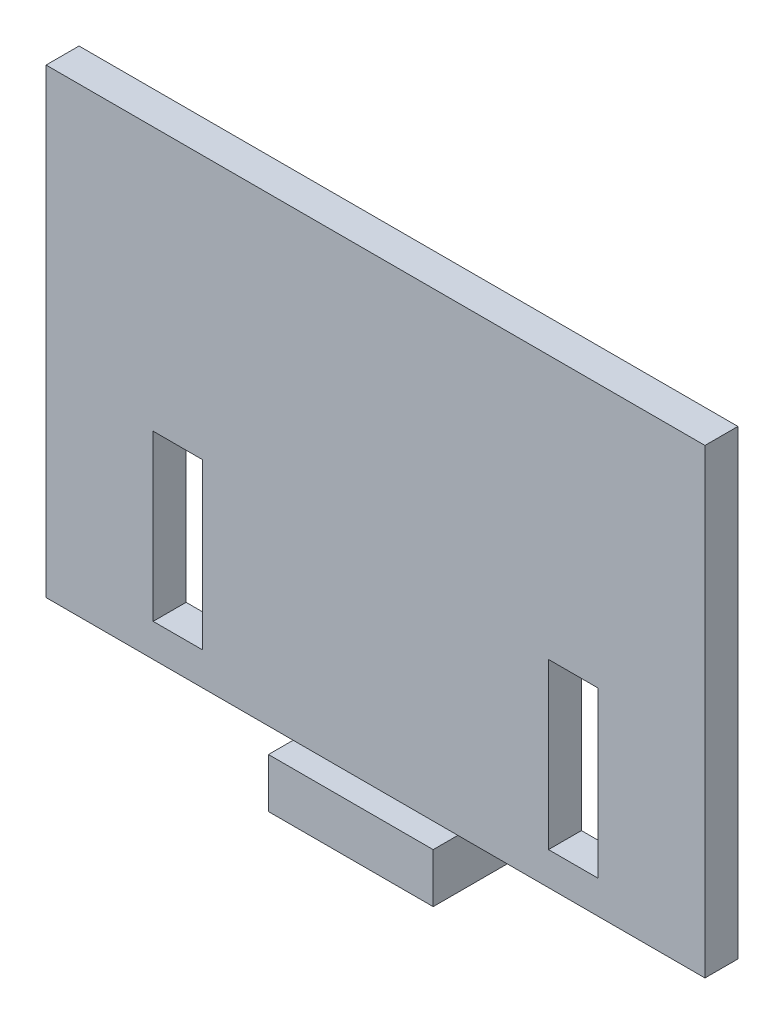
ISO-10303-21;
HEADER;
FILE_DESCRIPTION(('STEP AP214'),'2;1');
FILE_NAME('part.step','',(''),(''),'','','');
FILE_SCHEMA(('AUTOMOTIVE_DESIGN { 1 0 10303 214 1 1 1 1 }'));
ENDSEC;
DATA;
#1=APPLICATION_CONTEXT('core data for automotive mechanical design processes');
#2=APPLICATION_PROTOCOL_DEFINITION('international standard','automotive_design',2000,#1);
#3=PRODUCT_CONTEXT('',#1,'mechanical');
#4=PRODUCT('Part','Part','',(#3));
#5=PRODUCT_RELATED_PRODUCT_CATEGORY('part','',(#4));
#6=PRODUCT_DEFINITION_FORMATION('','',#4);
#7=PRODUCT_DEFINITION_CONTEXT('part definition',#1,'design');
#8=PRODUCT_DEFINITION('design','',#6,#7);
#9=PRODUCT_DEFINITION_SHAPE('','',#8);
#10=(LENGTH_UNIT() NAMED_UNIT(*) SI_UNIT(.MILLI.,.METRE.));
#11=(NAMED_UNIT(*) PLANE_ANGLE_UNIT() SI_UNIT($,.RADIAN.));
#12=(NAMED_UNIT(*) SI_UNIT($,.STERADIAN.) SOLID_ANGLE_UNIT());
#13=UNCERTAINTY_MEASURE_WITH_UNIT(LENGTH_MEASURE(1.E-05),#10,'distance_accuracy_value','');
#14=(GEOMETRIC_REPRESENTATION_CONTEXT(3) GLOBAL_UNCERTAINTY_ASSIGNED_CONTEXT((#13)) GLOBAL_UNIT_ASSIGNED_CONTEXT((#10,
#11,#12)) REPRESENTATION_CONTEXT('',''));
#15=CARTESIAN_POINT('',(0.,0.,0.));
#16=DIRECTION('',(0.,0.,1.));
#17=DIRECTION('',(1.,0.,0.));
#18=AXIS2_PLACEMENT_3D('',#15,#16,#17);
#19=CARTESIAN_POINT('',(-20.,-14.,2.));
#20=DIRECTION('',(0.,1.,0.));
#21=DIRECTION('',(0.,0.,1.));
#22=AXIS2_PLACEMENT_3D('',#19,#20,#21);
#23=PLANE('',#22);
#24=DIRECTION('',(0.,0.,1.));
#25=VECTOR('',#24,1.);
#26=CARTESIAN_POINT('',(5.,-14.,3.5));
#27=LINE('',#26,#25);
#28=CARTESIAN_POINT('',(5.,-14.,0.));
#29=VERTEX_POINT('',#28);
#30=CARTESIAN_POINT('',(5.,-14.,2.));
#31=VERTEX_POINT('',#30);
#32=EDGE_CURVE('E11',#29,#31,#27,.T.);
#33=ORIENTED_EDGE('',*,*,#32,.F.);
#34=DIRECTION('',(1.,0.,0.));
#35=VECTOR('',#34,1.);
#36=CARTESIAN_POINT('',(-20.,-14.,0.));
#37=LINE('',#36,#35);
#38=CARTESIAN_POINT('',(20.,-14.,0.));
#39=VERTEX_POINT('',#38);
#40=EDGE_CURVE('E278',#29,#39,#37,.T.);
#41=ORIENTED_EDGE('',*,*,#40,.T.);
#42=DIRECTION('',(0.,0.,-1.));
#43=VECTOR('',#42,1.);
#44=CARTESIAN_POINT('',(20.,-14.,2.));
#45=LINE('',#44,#43);
#46=CARTESIAN_POINT('',(20.,-14.,2.));
#47=VERTEX_POINT('',#46);
#48=EDGE_CURVE('E270',#47,#39,#45,.T.);
#49=ORIENTED_EDGE('',*,*,#48,.F.);
#50=DIRECTION('',(1.,0.,0.));
#51=VECTOR('',#50,1.);
#52=CARTESIAN_POINT('',(-20.,-14.,2.));
#53=LINE('',#52,#51);
#54=EDGE_CURVE('E55',#31,#47,#53,.T.);
#55=ORIENTED_EDGE('',*,*,#54,.F.);
#56=EDGE_LOOP('',(#33,#41,#49,#55));
#57=FACE_BOUND('',#56,.T.);
#58=ADVANCED_FACE('F36',(#57),#23,.F.);
#59=DIRECTION('',(0.,0.,-1.));
#60=VECTOR('',#59,1.);
#61=CARTESIAN_POINT('',(-5.,-14.,3.5));
#62=LINE('',#61,#60);
#63=CARTESIAN_POINT('',(-5.,-14.,2.));
#64=VERTEX_POINT('',#63);
#65=CARTESIAN_POINT('',(-5.,-14.,0.));
#66=VERTEX_POINT('',#65);
#67=EDGE_CURVE('E45',#64,#66,#62,.T.);
#68=ORIENTED_EDGE('',*,*,#67,.F.);
#69=CARTESIAN_POINT('',(-20.,-14.,2.));
#70=VERTEX_POINT('',#69);
#71=EDGE_CURVE('E268',#70,#64,#53,.T.);
#72=ORIENTED_EDGE('',*,*,#71,.F.);
#73=DIRECTION('',(0.,0.,-1.));
#74=VECTOR('',#73,1.);
#75=CARTESIAN_POINT('',(-20.,-14.,2.));
#76=LINE('',#75,#74);
#77=CARTESIAN_POINT('',(-20.,-14.,0.));
#78=VERTEX_POINT('',#77);
#79=EDGE_CURVE('E283',#70,#78,#76,.T.);
#80=ORIENTED_EDGE('',*,*,#79,.T.);
#81=EDGE_CURVE('E264',#78,#66,#37,.T.);
#82=ORIENTED_EDGE('',*,*,#81,.T.);
#83=EDGE_LOOP('',(#68,#72,#80,#82));
#84=FACE_BOUND('',#83,.T.);
#85=ADVANCED_FACE('F344',(#84),#23,.F.);
#86=CARTESIAN_POINT('',(20.,14.,2.));
#87=DIRECTION('',(-1.,0.,0.));
#88=DIRECTION('',(0.,-1.,0.));
#89=AXIS2_PLACEMENT_3D('',#86,#87,#88);
#90=PLANE('',#89);
#91=DIRECTION('',(0.,1.,0.));
#92=VECTOR('',#91,1.);
#93=CARTESIAN_POINT('',(20.,14.,0.));
#94=LINE('',#93,#92);
#95=CARTESIAN_POINT('',(20.,14.,0.));
#96=VERTEX_POINT('',#95);
#97=EDGE_CURVE('E259',#39,#96,#94,.T.);
#98=ORIENTED_EDGE('',*,*,#97,.T.);
#99=DIRECTION('',(0.,0.,-1.));
#100=VECTOR('',#99,1.);
#101=CARTESIAN_POINT('',(20.,14.,2.));
#102=LINE('',#101,#100);
#103=CARTESIAN_POINT('',(20.,14.,2.));
#104=VERTEX_POINT('',#103);
#105=EDGE_CURVE('E40',#104,#96,#102,.T.);
#106=ORIENTED_EDGE('',*,*,#105,.F.);
#107=DIRECTION('',(0.,1.,0.));
#108=VECTOR('',#107,1.);
#109=CARTESIAN_POINT('',(20.,14.,2.));
#110=LINE('',#109,#108);
#111=EDGE_CURVE('E260',#47,#104,#110,.T.);
#112=ORIENTED_EDGE('',*,*,#111,.F.);
#113=ORIENTED_EDGE('',*,*,#48,.T.);
#114=EDGE_LOOP('',(#98,#106,#112,#113));
#115=FACE_BOUND('',#114,.T.);
#116=ADVANCED_FACE('F38',(#115),#90,.F.);
#117=CARTESIAN_POINT('',(-20.,14.,2.));
#118=DIRECTION('',(0.,-1.,0.));
#119=DIRECTION('',(0.,0.,-1.));
#120=AXIS2_PLACEMENT_3D('',#117,#118,#119);
#121=PLANE('',#120);
#122=DIRECTION('',(-1.,0.,0.));
#123=VECTOR('',#122,1.);
#124=CARTESIAN_POINT('',(-20.,14.,0.));
#125=LINE('',#124,#123);
#126=CARTESIAN_POINT('',(-20.,14.,0.));
#127=VERTEX_POINT('',#126);
#128=EDGE_CURVE('E274',#96,#127,#125,.T.);
#129=ORIENTED_EDGE('',*,*,#128,.T.);
#130=DIRECTION('',(0.,0.,-1.));
#131=VECTOR('',#130,1.);
#132=CARTESIAN_POINT('',(-20.,14.,2.));
#133=LINE('',#132,#131);
#134=CARTESIAN_POINT('',(-20.,14.,2.));
#135=VERTEX_POINT('',#134);
#136=EDGE_CURVE('E285',#135,#127,#133,.T.);
#137=ORIENTED_EDGE('',*,*,#136,.F.);
#138=DIRECTION('',(-1.,0.,0.));
#139=VECTOR('',#138,1.);
#140=CARTESIAN_POINT('',(-20.,14.,2.));
#141=LINE('',#140,#139);
#142=EDGE_CURVE('E263',#104,#135,#141,.T.);
#143=ORIENTED_EDGE('',*,*,#142,.F.);
#144=ORIENTED_EDGE('',*,*,#105,.T.);
#145=EDGE_LOOP('',(#129,#137,#143,#144));
#146=FACE_BOUND('',#145,.T.);
#147=ADVANCED_FACE('F325',(#146),#121,.F.);
#148=CARTESIAN_POINT('',(-20.,14.,2.));
#149=DIRECTION('',(1.,0.,0.));
#150=DIRECTION('',(0.,1.,0.));
#151=AXIS2_PLACEMENT_3D('',#148,#149,#150);
#152=PLANE('',#151);
#153=DIRECTION('',(0.,-1.,0.));
#154=VECTOR('',#153,1.);
#155=CARTESIAN_POINT('',(-20.,14.,0.));
#156=LINE('',#155,#154);
#157=EDGE_CURVE('E276',#127,#78,#156,.T.);
#158=ORIENTED_EDGE('',*,*,#157,.T.);
#159=ORIENTED_EDGE('',*,*,#79,.F.);
#160=DIRECTION('',(0.,-1.,0.));
#161=VECTOR('',#160,1.);
#162=CARTESIAN_POINT('',(-20.,14.,2.));
#163=LINE('',#162,#161);
#164=EDGE_CURVE('E266',#135,#70,#163,.T.);
#165=ORIENTED_EDGE('',*,*,#164,.F.);
#166=ORIENTED_EDGE('',*,*,#136,.T.);
#167=EDGE_LOOP('',(#158,#159,#165,#166));
#168=FACE_BOUND('',#167,.T.);
#169=ADVANCED_FACE('F327',(#168),#152,.F.);
#170=CARTESIAN_POINT('',(0.,0.,2.));
#171=DIRECTION('',(0.,0.,1.));
#172=DIRECTION('',(1.,0.,0.));
#173=AXIS2_PLACEMENT_3D('',#170,#171,#172);
#174=PLANE('',#173);
#175=DIRECTION('',(0.,1.,0.));
#176=VECTOR('',#175,1.);
#177=CARTESIAN_POINT('',(-10.5,0.,2.));
#178=LINE('',#177,#176);
#179=CARTESIAN_POINT('',(-10.5,-12.,2.));
#180=VERTEX_POINT('',#179);
#181=CARTESIAN_POINT('',(-10.5,-1.99999999999999,2.));
#182=VERTEX_POINT('',#181);
#183=EDGE_CURVE('E256',#180,#182,#178,.T.);
#184=ORIENTED_EDGE('',*,*,#183,.F.);
#185=DIRECTION('',(1.,0.,0.));
#186=VECTOR('',#185,1.);
#187=CARTESIAN_POINT('',(0.,-12.,2.));
#188=LINE('',#187,#186);
#189=CARTESIAN_POINT('',(-13.5,-12.,2.));
#190=VERTEX_POINT('',#189);
#191=EDGE_CURVE('E254',#190,#180,#188,.T.);
#192=ORIENTED_EDGE('',*,*,#191,.F.);
#193=DIRECTION('',(0.,-1.,0.));
#194=VECTOR('',#193,1.);
#195=CARTESIAN_POINT('',(-13.5,0.,2.));
#196=LINE('',#195,#194);
#197=CARTESIAN_POINT('',(-13.5,-1.99999999999999,2.));
#198=VERTEX_POINT('',#197);
#199=EDGE_CURVE('E252',#198,#190,#196,.T.);
#200=ORIENTED_EDGE('',*,*,#199,.F.);
#201=DIRECTION('',(-1.,0.,0.));
#202=VECTOR('',#201,1.);
#203=CARTESIAN_POINT('',(0.,-1.99999999999999,2.));
#204=LINE('',#203,#202);
#205=EDGE_CURVE('E250',#182,#198,#204,.T.);
#206=ORIENTED_EDGE('',*,*,#205,.F.);
#207=EDGE_LOOP('',(#184,#192,#200,#206));
#208=FACE_BOUND('',#207,.T.);
#209=DIRECTION('',(0.,1.,0.));
#210=VECTOR('',#209,1.);
#211=CARTESIAN_POINT('',(13.5,0.,2.));
#212=LINE('',#211,#210);
#213=CARTESIAN_POINT('',(13.5,-12.,2.));
#214=VERTEX_POINT('',#213);
#215=CARTESIAN_POINT('',(13.5,-1.99999999999999,2.));
#216=VERTEX_POINT('',#215);
#217=EDGE_CURVE('E247',#214,#216,#212,.T.);
#218=ORIENTED_EDGE('',*,*,#217,.F.);
#219=DIRECTION('',(1.,0.,0.));
#220=VECTOR('',#219,1.);
#221=CARTESIAN_POINT('',(0.,-12.,2.));
#222=LINE('',#221,#220);
#223=CARTESIAN_POINT('',(10.5,-12.,2.));
#224=VERTEX_POINT('',#223);
#225=EDGE_CURVE('E245',#224,#214,#222,.T.);
#226=ORIENTED_EDGE('',*,*,#225,.F.);
#227=DIRECTION('',(0.,-1.,0.));
#228=VECTOR('',#227,1.);
#229=CARTESIAN_POINT('',(10.5,0.,2.));
#230=LINE('',#229,#228);
#231=CARTESIAN_POINT('',(10.5,-1.99999999999999,2.));
#232=VERTEX_POINT('',#231);
#233=EDGE_CURVE('E243',#232,#224,#230,.T.);
#234=ORIENTED_EDGE('',*,*,#233,.F.);
#235=DIRECTION('',(-1.,0.,0.));
#236=VECTOR('',#235,1.);
#237=CARTESIAN_POINT('',(0.,-1.99999999999999,2.));
#238=LINE('',#237,#236);
#239=EDGE_CURVE('E216',#216,#232,#238,.T.);
#240=ORIENTED_EDGE('',*,*,#239,.F.);
#241=EDGE_LOOP('',(#218,#226,#234,#240));
#242=FACE_BOUND('',#241,.T.);
#243=ORIENTED_EDGE('',*,*,#111,.T.);
#244=ORIENTED_EDGE('',*,*,#142,.T.);
#245=ORIENTED_EDGE('',*,*,#164,.T.);
#246=ORIENTED_EDGE('',*,*,#71,.T.);
#247=EDGE_CURVE('E271',#64,#31,#53,.T.);
#248=ORIENTED_EDGE('',*,*,#247,.T.);
#249=ORIENTED_EDGE('',*,*,#54,.T.);
#250=EDGE_LOOP('',(#243,#244,#245,#246,#248,#249));
#251=FACE_BOUND('',#250,.T.);
#252=ADVANCED_FACE('F329',(#208,#242,#251),#174,.T.);
#253=CARTESIAN_POINT('',(0.,0.,0.));
#254=DIRECTION('',(0.,0.,1.));
#255=DIRECTION('',(1.,0.,0.));
#256=AXIS2_PLACEMENT_3D('',#253,#254,#255);
#257=PLANE('',#256);
#258=DIRECTION('',(1.,0.,0.));
#259=VECTOR('',#258,1.);
#260=CARTESIAN_POINT('',(-13.5,-12.,0.));
#261=LINE('',#260,#259);
#262=CARTESIAN_POINT('',(-13.5,-12.,0.));
#263=VERTEX_POINT('',#262);
#264=CARTESIAN_POINT('',(-10.5,-12.,0.));
#265=VERTEX_POINT('',#264);
#266=EDGE_CURVE('E209',#263,#265,#261,.T.);
#267=ORIENTED_EDGE('',*,*,#266,.T.);
#268=DIRECTION('',(0.,1.,0.));
#269=VECTOR('',#268,1.);
#270=CARTESIAN_POINT('',(-10.5,-1.99999999999999,0.));
#271=LINE('',#270,#269);
#272=CARTESIAN_POINT('',(-10.5,-1.99999999999999,0.));
#273=VERTEX_POINT('',#272);
#274=EDGE_CURVE('E199',#265,#273,#271,.T.);
#275=ORIENTED_EDGE('',*,*,#274,.T.);
#276=DIRECTION('',(-1.,0.,0.));
#277=VECTOR('',#276,1.);
#278=CARTESIAN_POINT('',(-13.5,-1.99999999999999,0.));
#279=LINE('',#278,#277);
#280=CARTESIAN_POINT('',(-13.5,-1.99999999999999,0.));
#281=VERTEX_POINT('',#280);
#282=EDGE_CURVE('E202',#273,#281,#279,.T.);
#283=ORIENTED_EDGE('',*,*,#282,.T.);
#284=DIRECTION('',(0.,-1.,0.));
#285=VECTOR('',#284,1.);
#286=CARTESIAN_POINT('',(-13.5,-1.99999999999999,0.));
#287=LINE('',#286,#285);
#288=EDGE_CURVE('E206',#281,#263,#287,.T.);
#289=ORIENTED_EDGE('',*,*,#288,.T.);
#290=EDGE_LOOP('',(#267,#275,#283,#289));
#291=FACE_BOUND('',#290,.T.);
#292=DIRECTION('',(1.,0.,0.));
#293=VECTOR('',#292,1.);
#294=CARTESIAN_POINT('',(10.5,-12.,0.));
#295=LINE('',#294,#293);
#296=CARTESIAN_POINT('',(10.5,-12.,0.));
#297=VERTEX_POINT('',#296);
#298=CARTESIAN_POINT('',(13.5,-12.,0.));
#299=VERTEX_POINT('',#298);
#300=EDGE_CURVE('E226',#297,#299,#295,.T.);
#301=ORIENTED_EDGE('',*,*,#300,.T.);
#302=DIRECTION('',(0.,1.,0.));
#303=VECTOR('',#302,1.);
#304=CARTESIAN_POINT('',(13.5,-1.99999999999999,0.));
#305=LINE('',#304,#303);
#306=CARTESIAN_POINT('',(13.5,-1.99999999999999,0.));
#307=VERTEX_POINT('',#306);
#308=EDGE_CURVE('E203',#299,#307,#305,.T.);
#309=ORIENTED_EDGE('',*,*,#308,.T.);
#310=DIRECTION('',(-1.,0.,0.));
#311=VECTOR('',#310,1.);
#312=CARTESIAN_POINT('',(10.5,-1.99999999999999,0.));
#313=LINE('',#312,#311);
#314=CARTESIAN_POINT('',(10.5,-1.99999999999999,0.));
#315=VERTEX_POINT('',#314);
#316=EDGE_CURVE('E237',#307,#315,#313,.T.);
#317=ORIENTED_EDGE('',*,*,#316,.T.);
#318=DIRECTION('',(0.,-1.,0.));
#319=VECTOR('',#318,1.);
#320=CARTESIAN_POINT('',(10.5,-1.99999999999999,0.));
#321=LINE('',#320,#319);
#322=EDGE_CURVE('E234',#315,#297,#321,.T.);
#323=ORIENTED_EDGE('',*,*,#322,.T.);
#324=EDGE_LOOP('',(#301,#309,#317,#323));
#325=FACE_BOUND('',#324,.T.);
#326=ORIENTED_EDGE('',*,*,#97,.F.);
#327=ORIENTED_EDGE('',*,*,#40,.F.);
#328=EDGE_CURVE('E280',#66,#29,#37,.T.);
#329=ORIENTED_EDGE('',*,*,#328,.F.);
#330=ORIENTED_EDGE('',*,*,#81,.F.);
#331=ORIENTED_EDGE('',*,*,#157,.F.);
#332=ORIENTED_EDGE('',*,*,#128,.F.);
#333=EDGE_LOOP('',(#326,#327,#329,#330,#331,#332));
#334=FACE_BOUND('',#333,.T.);
#335=ADVANCED_FACE('F324',(#291,#325,#334),#257,.F.);
#336=CARTESIAN_POINT('',(13.5,-1.99999999999999,0.));
#337=DIRECTION('',(1.,0.,0.));
#338=DIRECTION('',(0.,1.,0.));
#339=AXIS2_PLACEMENT_3D('',#336,#337,#338);
#340=PLANE('',#339);
#341=ORIENTED_EDGE('',*,*,#217,.T.);
#342=DIRECTION('',(0.,0.,1.));
#343=VECTOR('',#342,1.);
#344=CARTESIAN_POINT('',(13.5,-1.99999999999999,0.));
#345=LINE('',#344,#343);
#346=EDGE_CURVE('E224',#307,#216,#345,.T.);
#347=ORIENTED_EDGE('',*,*,#346,.F.);
#348=ORIENTED_EDGE('',*,*,#308,.F.);
#349=DIRECTION('',(0.,0.,1.));
#350=VECTOR('',#349,1.);
#351=CARTESIAN_POINT('',(13.5,-12.,0.));
#352=LINE('',#351,#350);
#353=EDGE_CURVE('E190',#299,#214,#352,.T.);
#354=ORIENTED_EDGE('',*,*,#353,.T.);
#355=EDGE_LOOP('',(#341,#347,#348,#354));
#356=FACE_BOUND('',#355,.T.);
#357=ADVANCED_FACE('F386',(#356),#340,.F.);
#358=CARTESIAN_POINT('',(10.5,-12.,0.));
#359=DIRECTION('',(0.,-1.,0.));
#360=DIRECTION('',(0.,0.,-1.));
#361=AXIS2_PLACEMENT_3D('',#358,#359,#360);
#362=PLANE('',#361);
#363=ORIENTED_EDGE('',*,*,#225,.T.);
#364=ORIENTED_EDGE('',*,*,#353,.F.);
#365=ORIENTED_EDGE('',*,*,#300,.F.);
#366=DIRECTION('',(0.,0.,1.));
#367=VECTOR('',#366,1.);
#368=CARTESIAN_POINT('',(10.5,-12.,0.));
#369=LINE('',#368,#367);
#370=EDGE_CURVE('E193',#297,#224,#369,.T.);
#371=ORIENTED_EDGE('',*,*,#370,.T.);
#372=EDGE_LOOP('',(#363,#364,#365,#371));
#373=FACE_BOUND('',#372,.T.);
#374=ADVANCED_FACE('F520',(#373),#362,.F.);
#375=CARTESIAN_POINT('',(10.5,-1.99999999999999,0.));
#376=DIRECTION('',(-1.,0.,0.));
#377=DIRECTION('',(0.,-1.,0.));
#378=AXIS2_PLACEMENT_3D('',#375,#376,#377);
#379=PLANE('',#378);
#380=ORIENTED_EDGE('',*,*,#233,.T.);
#381=ORIENTED_EDGE('',*,*,#370,.F.);
#382=ORIENTED_EDGE('',*,*,#322,.F.);
#383=DIRECTION('',(0.,0.,1.));
#384=VECTOR('',#383,1.);
#385=CARTESIAN_POINT('',(10.5,-1.99999999999999,0.));
#386=LINE('',#385,#384);
#387=EDGE_CURVE('E227',#315,#232,#386,.T.);
#388=ORIENTED_EDGE('',*,*,#387,.T.);
#389=EDGE_LOOP('',(#380,#381,#382,#388));
#390=FACE_BOUND('',#389,.T.);
#391=ADVANCED_FACE('F509',(#390),#379,.F.);
#392=CARTESIAN_POINT('',(10.5,-1.99999999999999,0.));
#393=DIRECTION('',(0.,1.,0.));
#394=DIRECTION('',(0.,0.,1.));
#395=AXIS2_PLACEMENT_3D('',#392,#393,#394);
#396=PLANE('',#395);
#397=ORIENTED_EDGE('',*,*,#239,.T.);
#398=ORIENTED_EDGE('',*,*,#387,.F.);
#399=ORIENTED_EDGE('',*,*,#316,.F.);
#400=ORIENTED_EDGE('',*,*,#346,.T.);
#401=EDGE_LOOP('',(#397,#398,#399,#400));
#402=FACE_BOUND('',#401,.T.);
#403=ADVANCED_FACE('F498',(#402),#396,.F.);
#404=CARTESIAN_POINT('',(-10.5,-1.99999999999999,0.));
#405=DIRECTION('',(1.,0.,0.));
#406=DIRECTION('',(0.,1.,0.));
#407=AXIS2_PLACEMENT_3D('',#404,#405,#406);
#408=PLANE('',#407);
#409=ORIENTED_EDGE('',*,*,#183,.T.);
#410=DIRECTION('',(0.,0.,1.));
#411=VECTOR('',#410,1.);
#412=CARTESIAN_POINT('',(-10.5,-1.99999999999999,0.));
#413=LINE('',#412,#411);
#414=EDGE_CURVE('E212',#273,#182,#413,.T.);
#415=ORIENTED_EDGE('',*,*,#414,.F.);
#416=ORIENTED_EDGE('',*,*,#274,.F.);
#417=DIRECTION('',(0.,0.,1.));
#418=VECTOR('',#417,1.);
#419=CARTESIAN_POINT('',(-10.5,-12.,0.));
#420=LINE('',#419,#418);
#421=EDGE_CURVE('E213',#265,#180,#420,.T.);
#422=ORIENTED_EDGE('',*,*,#421,.T.);
#423=EDGE_LOOP('',(#409,#415,#416,#422));
#424=FACE_BOUND('',#423,.T.);
#425=ADVANCED_FACE('F487',(#424),#408,.F.);
#426=CARTESIAN_POINT('',(-13.5,-12.,0.));
#427=DIRECTION('',(0.,-1.,0.));
#428=DIRECTION('',(0.,0.,-1.));
#429=AXIS2_PLACEMENT_3D('',#426,#427,#428);
#430=PLANE('',#429);
#431=ORIENTED_EDGE('',*,*,#191,.T.);
#432=ORIENTED_EDGE('',*,*,#421,.F.);
#433=ORIENTED_EDGE('',*,*,#266,.F.);
#434=DIRECTION('',(0.,0.,1.));
#435=VECTOR('',#434,1.);
#436=CARTESIAN_POINT('',(-13.5,-12.,0.));
#437=LINE('',#436,#435);
#438=EDGE_CURVE('E217',#263,#190,#437,.T.);
#439=ORIENTED_EDGE('',*,*,#438,.T.);
#440=EDGE_LOOP('',(#431,#432,#433,#439));
#441=FACE_BOUND('',#440,.T.);
#442=ADVANCED_FACE('F476',(#441),#430,.F.);
#443=CARTESIAN_POINT('',(-13.5,-1.99999999999999,0.));
#444=DIRECTION('',(-1.,0.,0.));
#445=DIRECTION('',(0.,-1.,0.));
#446=AXIS2_PLACEMENT_3D('',#443,#444,#445);
#447=PLANE('',#446);
#448=ORIENTED_EDGE('',*,*,#199,.T.);
#449=ORIENTED_EDGE('',*,*,#438,.F.);
#450=ORIENTED_EDGE('',*,*,#288,.F.);
#451=DIRECTION('',(0.,0.,1.));
#452=VECTOR('',#451,1.);
#453=CARTESIAN_POINT('',(-13.5,-1.99999999999999,0.));
#454=LINE('',#453,#452);
#455=EDGE_CURVE('E220',#281,#198,#454,.T.);
#456=ORIENTED_EDGE('',*,*,#455,.T.);
#457=EDGE_LOOP('',(#448,#449,#450,#456));
#458=FACE_BOUND('',#457,.T.);
#459=ADVANCED_FACE('F465',(#458),#447,.F.);
#460=CARTESIAN_POINT('',(-13.5,-1.99999999999999,0.));
#461=DIRECTION('',(0.,1.,0.));
#462=DIRECTION('',(-1.,0.,0.));
#463=AXIS2_PLACEMENT_3D('',#460,#461,#462);
#464=PLANE('',#463);
#465=ORIENTED_EDGE('',*,*,#205,.T.);
#466=ORIENTED_EDGE('',*,*,#455,.F.);
#467=ORIENTED_EDGE('',*,*,#282,.F.);
#468=ORIENTED_EDGE('',*,*,#414,.T.);
#469=EDGE_LOOP('',(#465,#466,#467,#468));
#470=FACE_BOUND('',#469,.T.);
#471=ADVANCED_FACE('F342',(#470),#464,.F.);
#472=CARTESIAN_POINT('',(0.,-14.,0.));
#473=DIRECTION('',(0.,-1.,0.));
#474=DIRECTION('',(0.,0.,-1.));
#475=AXIS2_PLACEMENT_3D('',#472,#473,#474);
#476=PLANE('',#475);
#477=CARTESIAN_POINT('',(-5.,-14.,-1.5));
#478=VERTEX_POINT('',#477);
#479=EDGE_CURVE('E296',#66,#478,#62,.T.);
#480=ORIENTED_EDGE('',*,*,#479,.F.);
#481=ORIENTED_EDGE('',*,*,#328,.T.);
#482=CARTESIAN_POINT('',(5.,-14.,-1.5));
#483=VERTEX_POINT('',#482);
#484=EDGE_CURVE('E47',#483,#29,#27,.T.);
#485=ORIENTED_EDGE('',*,*,#484,.F.);
#486=DIRECTION('',(1.,0.,0.));
#487=VECTOR('',#486,1.);
#488=CARTESIAN_POINT('',(-5.,-14.,-1.5));
#489=LINE('',#488,#487);
#490=EDGE_CURVE('E184',#478,#483,#489,.T.);
#491=ORIENTED_EDGE('',*,*,#490,.F.);
#492=EDGE_LOOP('',(#480,#481,#485,#491));
#493=FACE_BOUND('',#492,.T.);
#494=ADVANCED_FACE('F316',(#493),#476,.F.);
#495=CARTESIAN_POINT('',(5.,-17.,3.5));
#496=DIRECTION('',(-1.,0.,0.));
#497=DIRECTION('',(0.,0.,1.));
#498=AXIS2_PLACEMENT_3D('',#495,#496,#497);
#499=PLANE('',#498);
#500=ORIENTED_EDGE('',*,*,#484,.T.);
#501=ORIENTED_EDGE('',*,*,#32,.T.);
#502=CARTESIAN_POINT('',(5.,-14.,3.5));
#503=VERTEX_POINT('',#502);
#504=EDGE_CURVE('E48',#31,#503,#27,.T.);
#505=ORIENTED_EDGE('',*,*,#504,.T.);
#506=DIRECTION('',(0.,1.,0.));
#507=VECTOR('',#506,1.);
#508=CARTESIAN_POINT('',(5.,-17.,3.5));
#509=LINE('',#508,#507);
#510=CARTESIAN_POINT('',(5.,-17.,3.5));
#511=VERTEX_POINT('',#510);
#512=EDGE_CURVE('E169',#511,#503,#509,.T.);
#513=ORIENTED_EDGE('',*,*,#512,.F.);
#514=DIRECTION('',(0.,0.,1.));
#515=VECTOR('',#514,1.);
#516=CARTESIAN_POINT('',(5.,-17.,3.5));
#517=LINE('',#516,#515);
#518=CARTESIAN_POINT('',(5.,-17.,-1.5));
#519=VERTEX_POINT('',#518);
#520=EDGE_CURVE('E175',#519,#511,#517,.T.);
#521=ORIENTED_EDGE('',*,*,#520,.F.);
#522=DIRECTION('',(0.,1.,0.));
#523=VECTOR('',#522,1.);
#524=CARTESIAN_POINT('',(5.,-17.,-1.5));
#525=LINE('',#524,#523);
#526=EDGE_CURVE('E307',#519,#483,#525,.T.);
#527=ORIENTED_EDGE('',*,*,#526,.T.);
#528=EDGE_LOOP('',(#500,#501,#505,#513,#521,#527));
#529=FACE_BOUND('',#528,.T.);
#530=ADVANCED_FACE('F187',(#529),#499,.F.);
#531=CARTESIAN_POINT('',(-5.,-17.,3.5));
#532=DIRECTION('',(0.,0.,-1.));
#533=DIRECTION('',(-1.,0.,0.));
#534=AXIS2_PLACEMENT_3D('',#531,#532,#533);
#535=PLANE('',#534);
#536=DIRECTION('',(-1.,0.,0.));
#537=VECTOR('',#536,1.);
#538=CARTESIAN_POINT('',(-5.,-14.,3.5));
#539=LINE('',#538,#537);
#540=CARTESIAN_POINT('',(-5.,-14.,3.5));
#541=VERTEX_POINT('',#540);
#542=EDGE_CURVE('E301',#503,#541,#539,.T.);
#543=ORIENTED_EDGE('',*,*,#542,.T.);
#544=DIRECTION('',(0.,1.,0.));
#545=VECTOR('',#544,1.);
#546=CARTESIAN_POINT('',(-5.,-17.,3.5));
#547=LINE('',#546,#545);
#548=CARTESIAN_POINT('',(-5.,-17.,3.5));
#549=VERTEX_POINT('',#548);
#550=EDGE_CURVE('E171',#549,#541,#547,.T.);
#551=ORIENTED_EDGE('',*,*,#550,.F.);
#552=DIRECTION('',(-1.,0.,0.));
#553=VECTOR('',#552,1.);
#554=CARTESIAN_POINT('',(-5.,-17.,3.5));
#555=LINE('',#554,#553);
#556=EDGE_CURVE('E165',#511,#549,#555,.T.);
#557=ORIENTED_EDGE('',*,*,#556,.F.);
#558=ORIENTED_EDGE('',*,*,#512,.T.);
#559=EDGE_LOOP('',(#543,#551,#557,#558));
#560=FACE_BOUND('',#559,.T.);
#561=ADVANCED_FACE('F167',(#560),#535,.F.);
#562=CARTESIAN_POINT('',(-5.,-17.,3.5));
#563=DIRECTION('',(1.,0.,0.));
#564=DIRECTION('',(0.,0.,-1.));
#565=AXIS2_PLACEMENT_3D('',#562,#563,#564);
#566=PLANE('',#565);
#567=EDGE_CURVE('E295',#541,#64,#62,.T.);
#568=ORIENTED_EDGE('',*,*,#567,.T.);
#569=ORIENTED_EDGE('',*,*,#67,.T.);
#570=ORIENTED_EDGE('',*,*,#479,.T.);
#571=DIRECTION('',(0.,1.,0.));
#572=VECTOR('',#571,1.);
#573=CARTESIAN_POINT('',(-5.,-17.,-1.5));
#574=LINE('',#573,#572);
#575=CARTESIAN_POINT('',(-5.,-17.,-1.5));
#576=VERTEX_POINT('',#575);
#577=EDGE_CURVE('E195',#576,#478,#574,.T.);
#578=ORIENTED_EDGE('',*,*,#577,.F.);
#579=DIRECTION('',(0.,0.,-1.));
#580=VECTOR('',#579,1.);
#581=CARTESIAN_POINT('',(-5.,-17.,3.5));
#582=LINE('',#581,#580);
#583=EDGE_CURVE('E174',#549,#576,#582,.T.);
#584=ORIENTED_EDGE('',*,*,#583,.F.);
#585=ORIENTED_EDGE('',*,*,#550,.T.);
#586=EDGE_LOOP('',(#568,#569,#570,#578,#584,#585));
#587=FACE_BOUND('',#586,.T.);
#588=ADVANCED_FACE('F308',(#587),#566,.F.);
#589=CARTESIAN_POINT('',(-5.,-17.,-1.5));
#590=DIRECTION('',(0.,0.,1.));
#591=DIRECTION('',(1.,0.,0.));
#592=AXIS2_PLACEMENT_3D('',#589,#590,#591);
#593=PLANE('',#592);
#594=ORIENTED_EDGE('',*,*,#490,.T.);
#595=ORIENTED_EDGE('',*,*,#526,.F.);
#596=DIRECTION('',(1.,0.,0.));
#597=VECTOR('',#596,1.);
#598=CARTESIAN_POINT('',(-5.,-17.,-1.5));
#599=LINE('',#598,#597);
#600=EDGE_CURVE('E180',#576,#519,#599,.T.);
#601=ORIENTED_EDGE('',*,*,#600,.F.);
#602=ORIENTED_EDGE('',*,*,#577,.T.);
#603=EDGE_LOOP('',(#594,#595,#601,#602));
#604=FACE_BOUND('',#603,.T.);
#605=ADVANCED_FACE('F311',(#604),#593,.F.);
#606=CARTESIAN_POINT('',(0.,-17.,0.));
#607=DIRECTION('',(0.,-1.,0.));
#608=DIRECTION('',(0.,0.,-1.));
#609=AXIS2_PLACEMENT_3D('',#606,#607,#608);
#610=PLANE('',#609);
#611=ORIENTED_EDGE('',*,*,#520,.T.);
#612=ORIENTED_EDGE('',*,*,#556,.T.);
#613=ORIENTED_EDGE('',*,*,#583,.T.);
#614=ORIENTED_EDGE('',*,*,#600,.T.);
#615=EDGE_LOOP('',(#611,#612,#613,#614));
#616=FACE_BOUND('',#615,.T.);
#617=ADVANCED_FACE('F178',(#616),#610,.T.);
#618=ORIENTED_EDGE('',*,*,#247,.F.);
#619=ORIENTED_EDGE('',*,*,#567,.F.);
#620=ORIENTED_EDGE('',*,*,#542,.F.);
#621=ORIENTED_EDGE('',*,*,#504,.F.);
#622=EDGE_LOOP('',(#618,#619,#620,#621));
#623=FACE_BOUND('',#622,.T.);
#624=ADVANCED_FACE('F333',(#623),#476,.F.);
#625=CLOSED_SHELL('',(#58,#85,#116,#147,#169,#252,#335,#357,#374,#391,#403,#425,#442,#459,#471,
#494,#530,#561,#588,#605,#617,#624));
#626=MANIFOLD_SOLID_BREP('B2',#625);
#627=ADVANCED_BREP_SHAPE_REPRESENTATION('',(#18,#626),#14);
#628=SHAPE_DEFINITION_REPRESENTATION(#9,#627);
ENDSEC;
END-ISO-10303-21;
